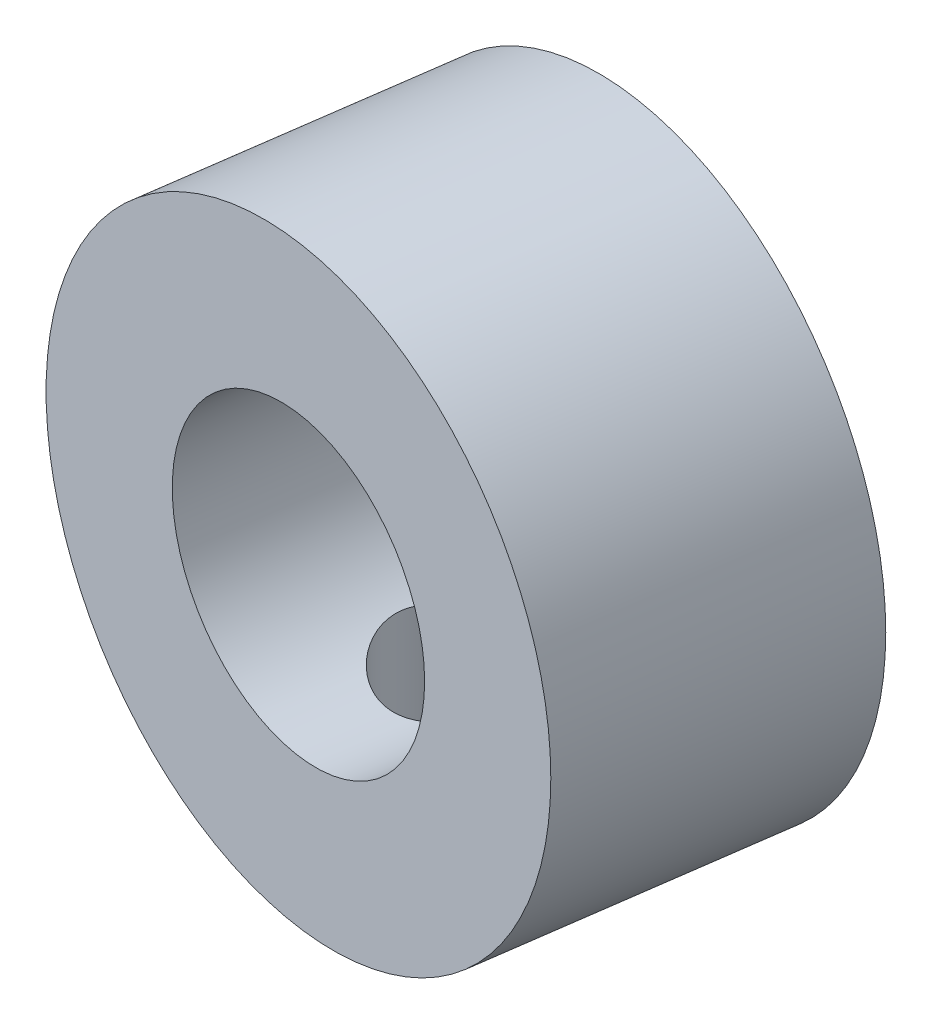
ISO-10303-21;
HEADER;
FILE_DESCRIPTION(('STEP AP214'),'2;1');
FILE_NAME('part.step','',(''),(''),'','','');
FILE_SCHEMA(('AUTOMOTIVE_DESIGN { 1 0 10303 214 1 1 1 1 }'));
ENDSEC;
DATA;
#1=APPLICATION_CONTEXT('core data for automotive mechanical design processes');
#2=APPLICATION_PROTOCOL_DEFINITION('international standard','automotive_design',2000,#1);
#3=PRODUCT_CONTEXT('',#1,'mechanical');
#4=PRODUCT('Part','Part','',(#3));
#5=PRODUCT_RELATED_PRODUCT_CATEGORY('part','',(#4));
#6=PRODUCT_DEFINITION_FORMATION('','',#4);
#7=PRODUCT_DEFINITION_CONTEXT('part definition',#1,'design');
#8=PRODUCT_DEFINITION('design','',#6,#7);
#9=PRODUCT_DEFINITION_SHAPE('','',#8);
#10=(LENGTH_UNIT() NAMED_UNIT(*) SI_UNIT(.MILLI.,.METRE.));
#11=(NAMED_UNIT(*) PLANE_ANGLE_UNIT() SI_UNIT($,.RADIAN.));
#12=(NAMED_UNIT(*) SI_UNIT($,.STERADIAN.) SOLID_ANGLE_UNIT());
#13=UNCERTAINTY_MEASURE_WITH_UNIT(LENGTH_MEASURE(1.E-05),#10,'distance_accuracy_value','');
#14=(GEOMETRIC_REPRESENTATION_CONTEXT(3) GLOBAL_UNCERTAINTY_ASSIGNED_CONTEXT((#13)) GLOBAL_UNIT_ASSIGNED_CONTEXT((#10,
#11,#12)) REPRESENTATION_CONTEXT('',''));
#15=CARTESIAN_POINT('',(0.,0.,0.));
#16=DIRECTION('',(0.,0.,1.));
#17=DIRECTION('',(1.,0.,0.));
#18=AXIS2_PLACEMENT_3D('',#15,#16,#17);
#19=CARTESIAN_POINT('',(-23.2303204234141,-6.53012803723683,-11.8413577701321));
#20=DIRECTION('',(-0.139254831399095,0.,0.990256578838035));
#21=DIRECTION('',(0.990256578838035,0.,0.139254831399095));
#22=AXIS2_PLACEMENT_3D('',#19,#20,#21);
#23=CYLINDRICAL_SURFACE('',#22,3.17500000000001);
#24=CARTESIAN_POINT('',(-23.0454858093224,-9.67333650484208,-16.3741551466992));
#25=CARTESIAN_POINT('',(-22.9755082979781,-9.68321445285625,-16.3741518143831));
#26=CARTESIAN_POINT('',(-22.9051242422469,-9.69090204562877,-16.3686981578645));
#27=CARTESIAN_POINT('',(-22.7656394069083,-9.70151275882121,-16.3467754662));
#28=CARTESIAN_POINT('',(-22.6965410265882,-9.70442771242154,-16.3302876173774));
#29=CARTESIAN_POINT('',(-22.5618131094884,-9.70560241301971,-16.2866969762825));
#30=CARTESIAN_POINT('',(-22.4961799711395,-9.70386709438746,-16.2596054615374));
#31=CARTESIAN_POINT('',(-22.3701682332658,-9.69633762654829,-16.1956296041442));
#32=CARTESIAN_POINT('',(-22.3097886643924,-9.69054422790037,-16.1587470731692));
#33=CARTESIAN_POINT('',(-22.1950382444201,-9.67575350744391,-16.0757440750493));
#34=CARTESIAN_POINT('',(-22.1407527750613,-9.66671670102967,-16.0295129704657));
#35=CARTESIAN_POINT('',(-22.0402656965987,-9.64667065270267,-15.9293290697798));
#36=CARTESIAN_POINT('',(-21.9940672360056,-9.63566064592611,-15.8753732810261));
#37=CARTESIAN_POINT('',(-21.9080844783572,-9.61229834431806,-15.7573819637854));
#38=CARTESIAN_POINT('',(-21.868887697402,-9.59990518428458,-15.692925545566));
#39=CARTESIAN_POINT('',(-21.8016722088728,-9.57606702221083,-15.5582471449803));
#40=CARTESIAN_POINT('',(-21.7736554201686,-9.56462218320183,-15.488024175368));
#41=CARTESIAN_POINT('',(-21.7292051518951,-9.54406369051316,-15.342110052082));
#42=CARTESIAN_POINT('',(-21.713009986735,-9.53500023840679,-15.2663385879344));
#43=CARTESIAN_POINT('',(-21.6937992092803,-9.52090729844476,-15.1127855417834));
#44=CARTESIAN_POINT('',(-21.690776862078,-9.51587575025929,-15.0350050074311));
#45=CARTESIAN_POINT('',(-21.6979486493034,-9.51079682536397,-14.8839161676446));
#46=CARTESIAN_POINT('',(-21.7074703404459,-9.51050617432485,-14.8105837838914));
#47=CARTESIAN_POINT('',(-21.7382907520937,-9.51432815904076,-14.6665635424374));
#48=CARTESIAN_POINT('',(-21.7595886925987,-9.51844050318015,-14.5958755099189));
#49=CARTESIAN_POINT('',(-21.8125124777538,-9.53029454769481,-14.4609975080473));
#50=CARTESIAN_POINT('',(-21.8438508908957,-9.53793759009216,-14.3966852732175));
#51=CARTESIAN_POINT('',(-21.9160546940466,-9.55579431571595,-14.2740465474597));
#52=CARTESIAN_POINT('',(-21.9569225702665,-9.56600866984603,-14.215721624334));
#53=CARTESIAN_POINT('',(-22.0492998512637,-9.5882548443236,-14.1037142410431));
#54=CARTESIAN_POINT('',(-22.1012244708555,-9.60035019218848,-14.0503868419259));
#55=CARTESIAN_POINT('',(-22.2131321860072,-9.62438570587218,-13.952920196726));
#56=CARTESIAN_POINT('',(-22.2731175836802,-9.63632582628654,-13.9087835846956));
#57=CARTESIAN_POINT('',(-22.40209707028,-9.65888025137448,-13.8293875641268));
#58=CARTESIAN_POINT('',(-22.4713411064251,-9.66942975822822,-13.7945137171687));
#59=CARTESIAN_POINT('',(-22.6151555563746,-9.68703310629449,-13.737004700796));
#60=CARTESIAN_POINT('',(-22.6897240265898,-9.6940882156857,-13.7143650910883));
#61=CARTESIAN_POINT('',(-22.8388026978799,-9.70319091046323,-13.6828610628392));
#62=CARTESIAN_POINT('',(-22.9131887085292,-9.70543284156571,-13.6734675052555));
#63=CARTESIAN_POINT('',(-23.0624561597727,-9.70475653956493,-13.6671022729577));
#64=CARTESIAN_POINT('',(-23.1373373965949,-9.70184031150185,-13.6701257721842));
#65=CARTESIAN_POINT('',(-23.2810681187696,-9.6910011754071,-13.6878713900556));
#66=CARTESIAN_POINT('',(-23.3500219314086,-9.68336460957417,-13.7019360764568));
#67=CARTESIAN_POINT('',(-23.4843419752807,-9.66369902010208,-13.7403255598959));
#68=CARTESIAN_POINT('',(-23.549707870498,-9.65166958586658,-13.764651316057));
#69=CARTESIAN_POINT('',(-23.6764334077915,-9.62370503147137,-13.8231654218548));
#70=CARTESIAN_POINT('',(-23.7376990404916,-9.60770311489104,-13.8575244301714));
#71=CARTESIAN_POINT('',(-23.8536801780744,-9.57297838320747,-13.9348320147086));
#72=CARTESIAN_POINT('',(-23.9083934508376,-9.55425464567343,-13.9777835048031));
#73=CARTESIAN_POINT('',(-24.0146478510856,-9.51369596436456,-14.0751703464369));
#74=CARTESIAN_POINT('',(-24.0655324493601,-9.49173180706455,-14.1302686551151));
#75=CARTESIAN_POINT('',(-24.1575724485076,-9.44784321134495,-14.2481372363657));
#76=CARTESIAN_POINT('',(-24.1987208563303,-9.42591881263037,-14.3109129744828));
#77=CARTESIAN_POINT('',(-24.2723578816882,-9.38287523827217,-14.4467335325446));
#78=CARTESIAN_POINT('',(-24.304217091449,-9.36187371492197,-14.5201602215747));
#79=CARTESIAN_POINT('',(-24.3546823302173,-9.32462092806095,-14.6725720701589));
#80=CARTESIAN_POINT('',(-24.3732998161416,-9.30836556530556,-14.7515523594793));
#81=CARTESIAN_POINT('',(-24.3952448861216,-9.28393047155336,-14.906682514982));
#82=CARTESIAN_POINT('',(-24.3996138861347,-9.27523677675872,-14.9826008338474));
#83=CARTESIAN_POINT('',(-24.3954471136348,-9.26527082799538,-15.1345462985255));
#84=CARTESIAN_POINT('',(-24.3869242877641,-9.26399113473239,-15.2105732586573));
#85=CARTESIAN_POINT('',(-24.3590935322893,-9.26872212667547,-15.3506900962481));
#86=CARTESIAN_POINT('',(-24.3412296505343,-9.27386166712487,-15.4151039860537));
#87=CARTESIAN_POINT('',(-24.2964890267135,-9.28935262547428,-15.5400522652497));
#88=CARTESIAN_POINT('',(-24.2696098491962,-9.29970545210519,-15.6005856010524));
#89=CARTESIAN_POINT('',(-24.2072256033478,-9.32472875685644,-15.7174663717702));
#90=CARTESIAN_POINT('',(-24.1715744917055,-9.33947333369634,-15.7737192743954));
#91=CARTESIAN_POINT('',(-24.0929176572052,-9.37181577358037,-15.8798867831303));
#92=CARTESIAN_POINT('',(-24.0499095639908,-9.38941455612999,-15.9297993373738));
#93=CARTESIAN_POINT('',(-23.9515605666394,-9.42840989488792,-16.0285168567223));
#94=CARTESIAN_POINT('',(-23.8953470237436,-9.45000489400893,-16.0763756353472));
#95=CARTESIAN_POINT('',(-23.7758493225911,-9.49321750645611,-16.162388307332));
#96=CARTESIAN_POINT('',(-23.7125575324136,-9.5148351188038,-16.2005315771711));
#97=CARTESIAN_POINT('',(-23.5752332245412,-9.55791822230339,-16.2686259676361));
#98=CARTESIAN_POINT('',(-23.5007523264057,-9.57925370426981,-16.297760452479));
#99=CARTESIAN_POINT('',(-23.3470173445642,-9.61803581503379,-16.3425295272014));
#100=CARTESIAN_POINT('',(-23.2677782874006,-9.63549394477806,-16.3582044481192));
#101=CARTESIAN_POINT('',(-23.1639191087039,-9.65458252331185,-16.3691682119062));
#102=CARTESIAN_POINT('',(-23.1403302943777,-9.65867064434948,-16.3710336942653));
#103=CARTESIAN_POINT('',(-23.0930052603731,-9.66636907248378,-16.3735278387446));
#104=CARTESIAN_POINT('',(-23.0692690150467,-9.66997929385756,-16.374156279251));
#105=CARTESIAN_POINT('',(-23.0454858093224,-9.67333650484208,-16.3741551466992));
#106=B_SPLINE_CURVE_WITH_KNOTS('',3,(#24,#25,#26,#27,#28,#29,#30,#31,#32,#33,#34,#35,#36,#37,
#38,#39,#40,#41,#42,#43,#44,#45,#46,#47,#48,#49,#50,#51,#52,#53,#54,#55,#56,#57,#58,#59,#60,#61,
#62,#63,#64,#65,#66,#67,#68,#69,#70,#71,#72,#73,#74,#75,#76,#77,#78,#79,#80,#81,#82,#83,#84,#85,
#86,#87,#88,#89,#90,#91,#92,#93,#94,#95,#96,#97,#98,#99,#100,#101,#102,#103,#104,#105),
.UNSPECIFIED.,.T.,.F.,(4,2,2,2,2,2,2,2,2,2,2,2,2,2,2,2,2,2,2,2,2,2,2,2,2,2,2,2,2,2,2,2,2,2,2,2,
2,2,2,2,4),(0.,0.211921651775985,0.424205560964183,0.636264306461919,0.848283841153868,
1.06297724415179,1.27775404860828,1.5060628819567,1.73441088408982,1.96724384465707,
2.19995775001787,2.42069030638963,2.64140824428401,2.85630055793466,3.07124899925562,
3.29646962417015,3.52175470807868,3.75531372320412,3.98878791340885,4.21264236817277,
4.43640982706702,4.64777965524947,4.85916924498432,5.0743876952165,5.28967925421359,
5.52312506701053,5.75673804745722,6.00370384563303,6.25045570490265,6.47871308617866,
6.70674139165498,6.90692522745382,7.10716318585335,7.31099199464869,7.51488659946173,
7.74468296312606,7.97472953155142,8.22182521046565,8.46817786730528,8.54019062469241,
8.61221628186128),.UNSPECIFIED.);
#107=CARTESIAN_POINT('',(-23.0454858093224,-9.67333650484208,-16.3741551466992));
#108=VERTEX_POINT('',#107);
#109=EDGE_CURVE('E77',#108,#108,#106,.T.);
#110=ORIENTED_EDGE('',*,*,#109,.T.);
#111=EDGE_LOOP('',(#110));
#112=FACE_BOUND('',#111,.T.);
#113=CARTESIAN_POINT('',(-22.3460522440298,-6.53012803723683,-18.1294870457536));
#114=DIRECTION('',(-0.139254831399095,0.,0.990256578838035));
#115=DIRECTION('',(0.990256578838035,0.,0.139254831399095));
#116=AXIS2_PLACEMENT_3D('',#113,#114,#115);
#117=CIRCLE('',#116,3.17500000000001);
#118=CARTESIAN_POINT('',(-19.201987606219,-6.53012803723683,-17.6873529560615));
#119=VERTEX_POINT('',#118);
#120=EDGE_CURVE('E61',#119,#119,#117,.T.);
#121=ORIENTED_EDGE('',*,*,#120,.F.);
#122=EDGE_LOOP('',(#121));
#123=FACE_BOUND('',#122,.T.);
#124=CARTESIAN_POINT('',(-23.2303204234141,-6.53012803723683,-11.8413577701321));
#125=DIRECTION('',(-0.139254831399095,0.,0.990256578838035));
#126=DIRECTION('',(0.990256578838035,0.,0.139254831399095));
#127=AXIS2_PLACEMENT_3D('',#124,#125,#126);
#128=CIRCLE('',#127,3.17500000000001);
#129=CARTESIAN_POINT('',(-20.0862557856033,-6.53012803723683,-11.39922368044));
#130=VERTEX_POINT('',#129);
#131=EDGE_CURVE('E74',#130,#130,#128,.T.);
#132=ORIENTED_EDGE('',*,*,#131,.T.);
#133=EDGE_LOOP('',(#132));
#134=FACE_BOUND('',#133,.T.);
#135=ADVANCED_FACE('F49',(#112,#123,#134),#23,.F.);
#136=CARTESIAN_POINT('',(-22.0408012528166,0.996977952400618,-18.0865611251143));
#137=DIRECTION('',(-0.139254831399095,0.,0.990256578838035));
#138=DIRECTION('',(0.990256578838035,0.,0.139254831399095));
#139=AXIS2_PLACEMENT_3D('',#136,#137,#138);
#140=PLANE('',#139);
#141=CARTESIAN_POINT('',(-22.3460522440298,-6.53012803723683,-18.1294870457536));
#142=DIRECTION('',(-0.139254831399095,0.,0.990256578838035));
#143=DIRECTION('',(0.990256578838035,0.,0.139254831399095));
#144=AXIS2_PLACEMENT_3D('',#141,#142,#143);
#145=CIRCLE('',#144,6.35000000000001);
#146=CARTESIAN_POINT('',(-16.0579229684083,-6.53012803723683,-17.2452188663694));
#147=VERTEX_POINT('',#146);
#148=EDGE_CURVE('E65',#147,#147,#145,.T.);
#149=ORIENTED_EDGE('',*,*,#148,.F.);
#150=EDGE_LOOP('',(#149));
#151=FACE_BOUND('',#150,.T.);
#152=ORIENTED_EDGE('',*,*,#120,.T.);
#153=EDGE_LOOP('',(#152));
#154=FACE_BOUND('',#153,.T.);
#155=ADVANCED_FACE('F93',(#151,#154),#140,.F.);
#156=CARTESIAN_POINT('',(-23.2303204234141,-6.53012803723683,-11.8413577701321));
#157=DIRECTION('',(-0.139254831399095,0.,0.990256578838035));
#158=DIRECTION('',(0.990256578838035,0.,0.139254831399095));
#159=AXIS2_PLACEMENT_3D('',#156,#157,#158);
#160=CYLINDRICAL_SURFACE('',#159,6.35000000000001);
#161=CARTESIAN_POINT('',(-23.0454858093224,-12.8642921076431,-16.3741551466992));
#162=CARTESIAN_POINT('',(-22.9710783887044,-12.8695043689561,-16.3741528911362));
#163=CARTESIAN_POINT('',(-22.8965569320766,-12.873482888664,-16.3679959968819));
#164=CARTESIAN_POINT('',(-22.7494265376997,-12.8787777940789,-16.3434630783565));
#165=CARTESIAN_POINT('',(-22.6768186184965,-12.880092789195,-16.3250806779593));
#166=CARTESIAN_POINT('',(-22.5356516734575,-12.8801618676169,-16.276606003927));
#167=CARTESIAN_POINT('',(-22.4670911486147,-12.8789169052367,-16.2465180973206));
#168=CARTESIAN_POINT('',(-22.3359274030676,-12.8742433306249,-16.1755034343283));
#169=CARTESIAN_POINT('',(-22.2733239943608,-12.8708147873319,-16.1345770201526));
#170=CARTESIAN_POINT('',(-22.1554885873668,-12.8623488380558,-16.0428294864537));
#171=CARTESIAN_POINT('',(-22.1002933878101,-12.8573037937487,-15.9919618467817));
#172=CARTESIAN_POINT('',(-21.9990913299107,-12.8463600159796,-15.8818624491728));
#173=CARTESIAN_POINT('',(-21.9530854875765,-12.8404611882445,-15.8226297676012));
#174=CARTESIAN_POINT('',(-21.8707952009104,-12.8285263478165,-15.696340076879));
#175=CARTESIAN_POINT('',(-21.8346856602071,-12.8224896878044,-15.6291690633394));
#176=CARTESIAN_POINT('',(-21.7742291962026,-12.8112120005196,-15.4896620921878));
#177=CARTESIAN_POINT('',(-21.7498823220587,-12.8059709765721,-15.4173261129925));
#178=CARTESIAN_POINT('',(-21.7136469522347,-12.7969991687514,-15.2694001048085));
#179=CARTESIAN_POINT('',(-21.7017749683079,-12.7932703904812,-15.1938059005757));
#180=CARTESIAN_POINT('',(-21.6909349449584,-12.7878512626311,-15.0416276472424));
#181=CARTESIAN_POINT('',(-21.6919655894073,-12.7861607051625,-14.9650436998964));
#182=CARTESIAN_POINT('',(-21.7068203441835,-12.7850609503432,-14.8141527961598));
#183=CARTESIAN_POINT('',(-21.7204723100152,-12.7856213944172,-14.739829070404));
#184=CARTESIAN_POINT('',(-21.7599251869173,-12.788878386831,-14.5945309108344));
#185=CARTESIAN_POINT('',(-21.7857259876159,-12.7915749157646,-14.523556446599));
#186=CARTESIAN_POINT('',(-21.8486114708159,-12.7987265779245,-14.3871722072427));
#187=CARTESIAN_POINT('',(-21.8856602342367,-12.8031761263557,-14.3217455544702));
#188=CARTESIAN_POINT('',(-21.9700149882877,-12.8132391641769,-14.197976625523));
#189=CARTESIAN_POINT('',(-22.017321892599,-12.8188527572451,-14.1396349811246));
#190=CARTESIAN_POINT('',(-22.1215659069362,-12.8305699432695,-14.0308938947508));
#191=CARTESIAN_POINT('',(-22.1786189490963,-12.8366789056057,-13.9806061384613));
#192=CARTESIAN_POINT('',(-22.300364889549,-12.84847343147,-13.890264078625));
#193=CARTESIAN_POINT('',(-22.3650581064451,-12.8541589773249,-13.8502102020624));
#194=CARTESIAN_POINT('',(-22.5007006608843,-12.8643046235278,-13.7812746408876));
#195=CARTESIAN_POINT('',(-22.5716829449362,-12.8687576968268,-13.7524566527378));
#196=CARTESIAN_POINT('',(-22.7175788648659,-12.8756629366809,-13.7071849087076));
#197=CARTESIAN_POINT('',(-22.7924920757617,-12.8781153190631,-13.6907298191788));
#198=CARTESIAN_POINT('',(-22.9430092610626,-12.8804736085163,-13.6708376921637));
#199=CARTESIAN_POINT('',(-23.0185892269272,-12.8804143778087,-13.6672231869386));
#200=CARTESIAN_POINT('',(-23.1692418070332,-12.877590356969,-13.6726217475395));
#201=CARTESIAN_POINT('',(-23.2443144636812,-12.8748257958675,-13.6816337444467));
#202=CARTESIAN_POINT('',(-23.390881359163,-12.8666947834772,-13.7117865910946));
#203=CARTESIAN_POINT('',(-23.4624078395025,-12.8613601200533,-13.7327798238323));
#204=CARTESIAN_POINT('',(-23.6008761533546,-12.8484370332982,-13.7861137982396));
#205=CARTESIAN_POINT('',(-23.667817682173,-12.8408484603613,-13.8184552931882));
#206=CARTESIAN_POINT('',(-23.7960943240277,-12.8238933454745,-13.8939608340039));
#207=CARTESIAN_POINT('',(-23.8573557135411,-12.8145072715224,-13.9372456211867));
#208=CARTESIAN_POINT('',(-23.9718213376184,-12.7947945097972,-14.0332350986859));
#209=CARTESIAN_POINT('',(-24.0250243098814,-12.7844676750645,-14.0859412619888));
#210=CARTESIAN_POINT('',(-24.1231339904313,-12.7635329198397,-14.200695136634));
#211=CARTESIAN_POINT('',(-24.1678229014023,-12.7529239764189,-14.2629290734337));
#212=CARTESIAN_POINT('',(-24.2461285760662,-12.7326672391498,-14.3941605233833));
#213=CARTESIAN_POINT('',(-24.2797450161334,-12.7230194734005,-14.4631582341481));
#214=CARTESIAN_POINT('',(-24.3349307966308,-12.7056402413153,-14.6061510601001));
#215=CARTESIAN_POINT('',(-24.3564853482944,-12.697911133825,-14.6801521858549));
#216=CARTESIAN_POINT('',(-24.3867386076501,-12.6852083932779,-14.8309645532288));
#217=CARTESIAN_POINT('',(-24.3954400165562,-12.6802341813901,-14.9077752009212));
#218=CARTESIAN_POINT('',(-24.3995749715258,-12.6736841768126,-15.0598056851977));
#219=CARTESIAN_POINT('',(-24.3953621668492,-12.6720198225709,-15.1350121255374));
#220=CARTESIAN_POINT('',(-24.3745232722917,-12.6720023813354,-15.2836801949624));
#221=CARTESIAN_POINT('',(-24.3578986292814,-12.6736489084239,-15.35714202639));
#222=CARTESIAN_POINT('',(-24.3131892823181,-12.6800122701385,-15.4988215048091));
#223=CARTESIAN_POINT('',(-24.2853250930773,-12.6846710110455,-15.567111611366));
#224=CARTESIAN_POINT('',(-24.2190042977863,-12.696526845104,-15.6980930655982));
#225=CARTESIAN_POINT('',(-24.1805469299205,-12.7037241208264,-15.7607840101765));
#226=CARTESIAN_POINT('',(-24.0934438274752,-12.7200887581674,-15.8799227216393));
#227=CARTESIAN_POINT('',(-24.0446434589035,-12.7292860832387,-15.9362531968389));
#228=CARTESIAN_POINT('',(-23.9385696426254,-12.7487080447715,-16.0400862131949));
#229=CARTESIAN_POINT('',(-23.8812935902904,-12.7589329967178,-16.0875860304767));
#230=CARTESIAN_POINT('',(-23.7580090233785,-12.7797812143366,-16.1737860406124));
#231=CARTESIAN_POINT('',(-23.6917973281908,-12.7904074985155,-16.2121951161986));
#232=CARTESIAN_POINT('',(-23.55376979587,-12.8107938202742,-16.2773338884229));
#233=CARTESIAN_POINT('',(-23.4819577367534,-12.820554432499,-16.3040713797651));
#234=CARTESIAN_POINT('',(-23.349469207541,-12.8365766385947,-16.3409699293755));
#235=CARTESIAN_POINT('',(-23.2894465093627,-12.8431474161111,-16.3533795742824));
#236=CARTESIAN_POINT('',(-23.1681369408321,-12.854855807563,-16.3699728375553));
#237=CARTESIAN_POINT('',(-23.1068501554286,-12.8599935174681,-16.3741570068785));
#238=CARTESIAN_POINT('',(-23.0454858093224,-12.8642921076431,-16.3741551466992));
#239=B_SPLINE_CURVE_WITH_KNOTS('',3,(#161,#162,#163,#164,#165,#166,#167,#168,#169,#170,#171,
#172,#173,#174,#175,#176,#177,#178,#179,#180,#181,#182,#183,#184,#185,#186,#187,#188,#189,#190,
#191,#192,#193,#194,#195,#196,#197,#198,#199,#200,#201,#202,#203,#204,#205,#206,#207,#208,#209,
#210,#211,#212,#213,#214,#215,#216,#217,#218,#219,#220,#221,#222,#223,#224,#225,#226,#227,#228,
#229,#230,#231,#232,#233,#234,#235,#236,#237,#238),.UNSPECIFIED.,.T.,.F.,(4,2,2,2,2,2,2,2,2,2,2,
2,2,2,2,2,2,2,2,2,2,2,2,2,2,2,2,2,2,2,2,2,2,2,2,2,2,2,4),(0.,0.223549961078899,
0.447216604583486,0.670799883609208,0.894376104156651,1.11902474956677,1.34369821921054,
1.57211826135623,1.80053925808407,2.02926221325791,2.25796183781019,2.48358748709107,
2.70921108660999,2.93412162927193,3.15905221270053,3.38687303182918,3.61470335468541,
3.84380709811181,4.07288612340866,4.29878649251926,4.52466773879139,4.747824266278,
4.97099560933218,5.19674580606654,5.42253132867013,5.65348550317009,5.88444642739057,
6.11568990979184,6.34688478718881,6.57180560038298,6.79670019824282,7.01738185708682,
7.23807939054541,7.46234420929663,7.6866780896457,7.91743950774173,8.14804657840307,
8.33242222291624,8.51678551719172),.UNSPECIFIED.);
#240=CARTESIAN_POINT('',(-23.0454858093224,-12.8642921076431,-16.3741551466992));
#241=VERTEX_POINT('',#240);
#242=EDGE_CURVE('E12',#241,#241,#239,.T.);
#243=ORIENTED_EDGE('',*,*,#242,.F.);
#244=EDGE_LOOP('',(#243));
#245=FACE_BOUND('',#244,.T.);
#246=ORIENTED_EDGE('',*,*,#148,.T.);
#247=EDGE_LOOP('',(#246));
#248=FACE_BOUND('',#247,.T.);
#249=CARTESIAN_POINT('',(-23.2303204234141,-6.53012803723683,-11.8413577701321));
#250=DIRECTION('',(-0.139254831399095,0.,0.990256578838035));
#251=DIRECTION('',(0.990256578838035,0.,0.139254831399095));
#252=AXIS2_PLACEMENT_3D('',#249,#250,#251);
#253=CIRCLE('',#252,6.35000000000001);
#254=CARTESIAN_POINT('',(-16.9421911477925,-6.53012803723683,-10.9570895907478));
#255=VERTEX_POINT('',#254);
#256=EDGE_CURVE('E69',#255,#255,#253,.T.);
#257=ORIENTED_EDGE('',*,*,#256,.F.);
#258=EDGE_LOOP('',(#257));
#259=FACE_BOUND('',#258,.T.);
#260=ADVANCED_FACE('F89',(#245,#248,#259),#160,.T.);
#261=CARTESIAN_POINT('',(-22.9250694322009,0.996977952400616,-11.7984318494927));
#262=DIRECTION('',(-0.139254831399095,0.,0.990256578838035));
#263=DIRECTION('',(0.990256578838035,0.,0.139254831399095));
#264=AXIS2_PLACEMENT_3D('',#261,#262,#263);
#265=PLANE('',#264);
#266=ORIENTED_EDGE('',*,*,#256,.T.);
#267=EDGE_LOOP('',(#266));
#268=FACE_BOUND('',#267,.T.);
#269=ORIENTED_EDGE('',*,*,#131,.F.);
#270=EDGE_LOOP('',(#269));
#271=FACE_BOUND('',#270,.T.);
#272=ADVANCED_FACE('F86',(#268,#271),#265,.T.);
#273=CARTESIAN_POINT('',(-23.0454858093224,-12.8801280372368,-15.0216051466992));
#274=DIRECTION('',(0.,-1.,0.));
#275=DIRECTION('',(0.,0.,-1.));
#276=AXIS2_PLACEMENT_3D('',#273,#274,#275);
#277=CYLINDRICAL_SURFACE('',#276,1.35254999999999);
#278=ORIENTED_EDGE('',*,*,#242,.T.);
#279=EDGE_LOOP('',(#278));
#280=FACE_BOUND('',#279,.T.);
#281=ORIENTED_EDGE('',*,*,#109,.F.);
#282=EDGE_LOOP('',(#281));
#283=FACE_BOUND('',#282,.T.);
#284=ADVANCED_FACE('F82',(#280,#283),#277,.F.);
#285=CLOSED_SHELL('',(#135,#155,#260,#272,#284));
#286=MANIFOLD_SOLID_BREP('B2',#285);
#287=ADVANCED_BREP_SHAPE_REPRESENTATION('',(#18,#286),#14);
#288=SHAPE_DEFINITION_REPRESENTATION(#9,#287);
ENDSEC;
END-ISO-10303-21;
